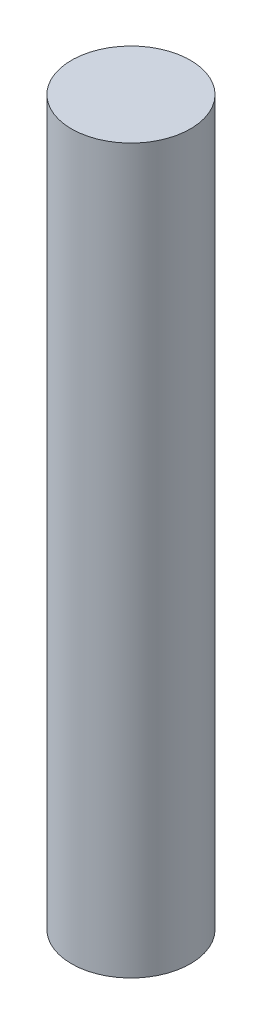
ISO-10303-21;
HEADER;
FILE_DESCRIPTION(('STEP AP214'),'2;1');
FILE_NAME('part.step','',(''),(''),'','','');
FILE_SCHEMA(('AUTOMOTIVE_DESIGN { 1 0 10303 214 1 1 1 1 }'));
ENDSEC;
DATA;
#1=APPLICATION_CONTEXT('core data for automotive mechanical design processes');
#2=APPLICATION_PROTOCOL_DEFINITION('international standard','automotive_design',2000,#1);
#3=PRODUCT_CONTEXT('',#1,'mechanical');
#4=PRODUCT('Part','Part','',(#3));
#5=PRODUCT_RELATED_PRODUCT_CATEGORY('part','',(#4));
#6=PRODUCT_DEFINITION_FORMATION('','',#4);
#7=PRODUCT_DEFINITION_CONTEXT('part definition',#1,'design');
#8=PRODUCT_DEFINITION('design','',#6,#7);
#9=PRODUCT_DEFINITION_SHAPE('','',#8);
#10=(LENGTH_UNIT() NAMED_UNIT(*) SI_UNIT(.MILLI.,.METRE.));
#11=(NAMED_UNIT(*) PLANE_ANGLE_UNIT() SI_UNIT($,.RADIAN.));
#12=(NAMED_UNIT(*) SI_UNIT($,.STERADIAN.) SOLID_ANGLE_UNIT());
#13=UNCERTAINTY_MEASURE_WITH_UNIT(LENGTH_MEASURE(1.E-05),#10,'distance_accuracy_value','');
#14=(GEOMETRIC_REPRESENTATION_CONTEXT(3) GLOBAL_UNCERTAINTY_ASSIGNED_CONTEXT((#13)) GLOBAL_UNIT_ASSIGNED_CONTEXT((#10,
#11,#12)) REPRESENTATION_CONTEXT('',''));
#15=CARTESIAN_POINT('',(0.,0.,0.));
#16=DIRECTION('',(0.,0.,1.));
#17=DIRECTION('',(1.,0.,0.));
#18=AXIS2_PLACEMENT_3D('',#15,#16,#17);
#19=CARTESIAN_POINT('',(0.,35.56,0.));
#20=DIRECTION('',(0.,-1.,0.));
#21=DIRECTION('',(0.,0.,-1.));
#22=AXIS2_PLACEMENT_3D('',#19,#20,#21);
#23=CYLINDRICAL_SURFACE('',#22,2.925);
#24=CARTESIAN_POINT('',(0.,35.56,0.));
#25=DIRECTION('',(0.,1.,0.));
#26=DIRECTION('',(0.,0.,1.));
#27=AXIS2_PLACEMENT_3D('',#24,#25,#26);
#28=CIRCLE('',#27,2.925);
#29=CARTESIAN_POINT('',(0.,35.56,2.925));
#30=VERTEX_POINT('',#29);
#31=EDGE_CURVE('E10',#30,#30,#28,.T.);
#32=ORIENTED_EDGE('',*,*,#31,.F.);
#33=EDGE_LOOP('',(#32));
#34=FACE_BOUND('',#33,.T.);
#35=CARTESIAN_POINT('',(0.,0.,0.));
#36=DIRECTION('',(0.,1.,0.));
#37=DIRECTION('',(0.,0.,1.));
#38=AXIS2_PLACEMENT_3D('',#35,#36,#37);
#39=CIRCLE('',#38,2.925);
#40=CARTESIAN_POINT('',(0.,0.,2.925));
#41=VERTEX_POINT('',#40);
#42=EDGE_CURVE('E35',#41,#41,#39,.T.);
#43=ORIENTED_EDGE('',*,*,#42,.T.);
#44=EDGE_LOOP('',(#43));
#45=FACE_BOUND('',#44,.T.);
#46=ADVANCED_FACE('F32',(#34,#45),#23,.T.);
#47=CARTESIAN_POINT('',(0.,35.56,0.));
#48=DIRECTION('',(0.,1.,0.));
#49=DIRECTION('',(0.,0.,1.));
#50=AXIS2_PLACEMENT_3D('',#47,#48,#49);
#51=PLANE('',#50);
#52=ORIENTED_EDGE('',*,*,#31,.T.);
#53=EDGE_LOOP('',(#52));
#54=FACE_BOUND('',#53,.T.);
#55=ADVANCED_FACE('F47',(#54),#51,.T.);
#56=CARTESIAN_POINT('',(0.,0.,0.));
#57=DIRECTION('',(0.,1.,0.));
#58=DIRECTION('',(0.,0.,1.));
#59=AXIS2_PLACEMENT_3D('',#56,#57,#58);
#60=PLANE('',#59);
#61=ORIENTED_EDGE('',*,*,#42,.F.);
#62=EDGE_LOOP('',(#61));
#63=FACE_BOUND('',#62,.T.);
#64=ADVANCED_FACE('F45',(#63),#60,.F.);
#65=CLOSED_SHELL('',(#46,#55,#64));
#66=MANIFOLD_SOLID_BREP('B2',#65);
#67=ADVANCED_BREP_SHAPE_REPRESENTATION('',(#18,#66),#14);
#68=SHAPE_DEFINITION_REPRESENTATION(#9,#67);
ENDSEC;
END-ISO-10303-21;
